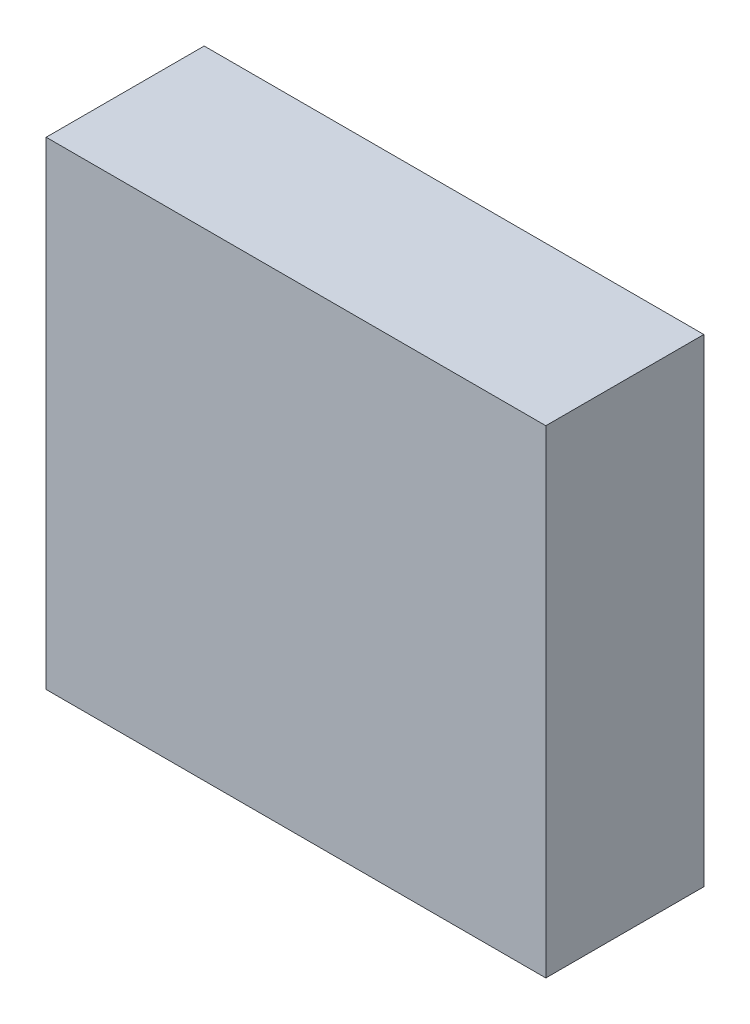
ISO-10303-21;
HEADER;
FILE_DESCRIPTION(('STEP AP214'),'2;1');
FILE_NAME('part.step','',(''),(''),'','','');
FILE_SCHEMA(('AUTOMOTIVE_DESIGN { 1 0 10303 214 1 1 1 1 }'));
ENDSEC;
DATA;
#1=APPLICATION_CONTEXT('core data for automotive mechanical design processes');
#2=APPLICATION_PROTOCOL_DEFINITION('international standard','automotive_design',2000,#1);
#3=PRODUCT_CONTEXT('',#1,'mechanical');
#4=PRODUCT('Part','Part','',(#3));
#5=PRODUCT_RELATED_PRODUCT_CATEGORY('part','',(#4));
#6=PRODUCT_DEFINITION_FORMATION('','',#4);
#7=PRODUCT_DEFINITION_CONTEXT('part definition',#1,'design');
#8=PRODUCT_DEFINITION('design','',#6,#7);
#9=PRODUCT_DEFINITION_SHAPE('','',#8);
#10=(LENGTH_UNIT() NAMED_UNIT(*) SI_UNIT(.MILLI.,.METRE.));
#11=(NAMED_UNIT(*) PLANE_ANGLE_UNIT() SI_UNIT($,.RADIAN.));
#12=(NAMED_UNIT(*) SI_UNIT($,.STERADIAN.) SOLID_ANGLE_UNIT());
#13=UNCERTAINTY_MEASURE_WITH_UNIT(LENGTH_MEASURE(1.E-05),#10,'distance_accuracy_value','');
#14=(GEOMETRIC_REPRESENTATION_CONTEXT(3) GLOBAL_UNCERTAINTY_ASSIGNED_CONTEXT((#13)) GLOBAL_UNIT_ASSIGNED_CONTEXT((#10,
#11,#12)) REPRESENTATION_CONTEXT('',''));
#15=CARTESIAN_POINT('',(0.,0.,0.));
#16=DIRECTION('',(0.,0.,1.));
#17=DIRECTION('',(1.,0.,0.));
#18=AXIS2_PLACEMENT_3D('',#15,#16,#17);
#19=CARTESIAN_POINT('',(-58.5,-56.,37.));
#20=DIRECTION('',(-1.,0.,0.));
#21=DIRECTION('',(0.,0.,1.));
#22=AXIS2_PLACEMENT_3D('',#19,#20,#21);
#23=PLANE('',#22);
#24=DIRECTION('',(0.,1.,0.));
#25=VECTOR('',#24,1.);
#26=CARTESIAN_POINT('',(-58.5,-56.,0.));
#27=LINE('',#26,#25);
#28=CARTESIAN_POINT('',(-58.5,-56.,0.));
#29=VERTEX_POINT('',#28);
#30=CARTESIAN_POINT('',(-58.5,56.,0.));
#31=VERTEX_POINT('',#30);
#32=EDGE_CURVE('E110',#29,#31,#27,.T.);
#33=ORIENTED_EDGE('',*,*,#32,.F.);
#34=DIRECTION('',(0.,0.,-1.));
#35=VECTOR('',#34,1.);
#36=CARTESIAN_POINT('',(-58.5,-56.,37.));
#37=LINE('',#36,#35);
#38=CARTESIAN_POINT('',(-58.5,-56.,37.));
#39=VERTEX_POINT('',#38);
#40=EDGE_CURVE('E11',#39,#29,#37,.T.);
#41=ORIENTED_EDGE('',*,*,#40,.F.);
#42=DIRECTION('',(0.,1.,0.));
#43=VECTOR('',#42,1.);
#44=CARTESIAN_POINT('',(-58.5,-56.,37.));
#45=LINE('',#44,#43);
#46=CARTESIAN_POINT('',(-58.5,56.,37.));
#47=VERTEX_POINT('',#46);
#48=EDGE_CURVE('E103',#39,#47,#45,.T.);
#49=ORIENTED_EDGE('',*,*,#48,.T.);
#50=DIRECTION('',(0.,0.,-1.));
#51=VECTOR('',#50,1.);
#52=CARTESIAN_POINT('',(-58.5,56.,37.));
#53=LINE('',#52,#51);
#54=EDGE_CURVE('E42',#47,#31,#53,.T.);
#55=ORIENTED_EDGE('',*,*,#54,.T.);
#56=EDGE_LOOP('',(#33,#41,#49,#55));
#57=FACE_BOUND('',#56,.T.);
#58=ADVANCED_FACE('F39',(#57),#23,.T.);
#59=CARTESIAN_POINT('',(-58.5,-56.,37.));
#60=DIRECTION('',(0.,1.,0.));
#61=DIRECTION('',(0.,0.,1.));
#62=AXIS2_PLACEMENT_3D('',#59,#60,#61);
#63=PLANE('',#62);
#64=DIRECTION('',(1.,0.,0.));
#65=VECTOR('',#64,1.);
#66=CARTESIAN_POINT('',(-58.5,-56.,0.));
#67=LINE('',#66,#65);
#68=CARTESIAN_POINT('',(58.5,-56.,0.));
#69=VERTEX_POINT('',#68);
#70=EDGE_CURVE('E73',#29,#69,#67,.T.);
#71=ORIENTED_EDGE('',*,*,#70,.T.);
#72=DIRECTION('',(0.,0.,-1.));
#73=VECTOR('',#72,1.);
#74=CARTESIAN_POINT('',(58.5,-56.,37.));
#75=LINE('',#74,#73);
#76=CARTESIAN_POINT('',(58.5,-56.,37.));
#77=VERTEX_POINT('',#76);
#78=EDGE_CURVE('E49',#77,#69,#75,.T.);
#79=ORIENTED_EDGE('',*,*,#78,.F.);
#80=DIRECTION('',(1.,0.,0.));
#81=VECTOR('',#80,1.);
#82=CARTESIAN_POINT('',(-58.5,-56.,37.));
#83=LINE('',#82,#81);
#84=EDGE_CURVE('E90',#39,#77,#83,.T.);
#85=ORIENTED_EDGE('',*,*,#84,.F.);
#86=ORIENTED_EDGE('',*,*,#40,.T.);
#87=EDGE_LOOP('',(#71,#79,#85,#86));
#88=FACE_BOUND('',#87,.T.);
#89=ADVANCED_FACE('F126',(#88),#63,.F.);
#90=CARTESIAN_POINT('',(58.5,-56.,37.));
#91=DIRECTION('',(-1.,0.,0.));
#92=DIRECTION('',(0.,0.,1.));
#93=AXIS2_PLACEMENT_3D('',#90,#91,#92);
#94=PLANE('',#93);
#95=DIRECTION('',(0.,1.,0.));
#96=VECTOR('',#95,1.);
#97=CARTESIAN_POINT('',(58.5,-56.,0.));
#98=LINE('',#97,#96);
#99=CARTESIAN_POINT('',(58.5,56.,0.));
#100=VERTEX_POINT('',#99);
#101=EDGE_CURVE('E98',#69,#100,#98,.T.);
#102=ORIENTED_EDGE('',*,*,#101,.T.);
#103=DIRECTION('',(0.,0.,-1.));
#104=VECTOR('',#103,1.);
#105=CARTESIAN_POINT('',(58.5,56.,37.));
#106=LINE('',#105,#104);
#107=CARTESIAN_POINT('',(58.5,56.,37.));
#108=VERTEX_POINT('',#107);
#109=EDGE_CURVE('E95',#108,#100,#106,.T.);
#110=ORIENTED_EDGE('',*,*,#109,.F.);
#111=DIRECTION('',(0.,1.,0.));
#112=VECTOR('',#111,1.);
#113=CARTESIAN_POINT('',(58.5,-56.,37.));
#114=LINE('',#113,#112);
#115=EDGE_CURVE('E85',#77,#108,#114,.T.);
#116=ORIENTED_EDGE('',*,*,#115,.F.);
#117=ORIENTED_EDGE('',*,*,#78,.T.);
#118=EDGE_LOOP('',(#102,#110,#116,#117));
#119=FACE_BOUND('',#118,.T.);
#120=ADVANCED_FACE('F96',(#119),#94,.F.);
#121=CARTESIAN_POINT('',(-58.5,56.,37.));
#122=DIRECTION('',(0.,1.,0.));
#123=DIRECTION('',(0.,0.,1.));
#124=AXIS2_PLACEMENT_3D('',#121,#122,#123);
#125=PLANE('',#124);
#126=DIRECTION('',(1.,0.,0.));
#127=VECTOR('',#126,1.);
#128=CARTESIAN_POINT('',(-58.5,56.,0.));
#129=LINE('',#128,#127);
#130=EDGE_CURVE('E114',#31,#100,#129,.T.);
#131=ORIENTED_EDGE('',*,*,#130,.F.);
#132=ORIENTED_EDGE('',*,*,#54,.F.);
#133=DIRECTION('',(1.,0.,0.));
#134=VECTOR('',#133,1.);
#135=CARTESIAN_POINT('',(-58.5,56.,37.));
#136=LINE('',#135,#134);
#137=EDGE_CURVE('E89',#47,#108,#136,.T.);
#138=ORIENTED_EDGE('',*,*,#137,.T.);
#139=ORIENTED_EDGE('',*,*,#109,.T.);
#140=EDGE_LOOP('',(#131,#132,#138,#139));
#141=FACE_BOUND('',#140,.T.);
#142=ADVANCED_FACE('F101',(#141),#125,.T.);
#143=CARTESIAN_POINT('',(0.,0.,37.));
#144=DIRECTION('',(0.,0.,-1.));
#145=DIRECTION('',(-1.,0.,0.));
#146=AXIS2_PLACEMENT_3D('',#143,#144,#145);
#147=PLANE('',#146);
#148=ORIENTED_EDGE('',*,*,#48,.F.);
#149=ORIENTED_EDGE('',*,*,#84,.T.);
#150=ORIENTED_EDGE('',*,*,#115,.T.);
#151=ORIENTED_EDGE('',*,*,#137,.F.);
#152=EDGE_LOOP('',(#148,#149,#150,#151));
#153=FACE_BOUND('',#152,.T.);
#154=ADVANCED_FACE('F88',(#153),#147,.F.);
#155=CARTESIAN_POINT('',(0.,0.,0.));
#156=DIRECTION('',(0.,0.,-1.));
#157=DIRECTION('',(-1.,0.,0.));
#158=AXIS2_PLACEMENT_3D('',#155,#156,#157);
#159=PLANE('',#158);
#160=ORIENTED_EDGE('',*,*,#32,.T.);
#161=ORIENTED_EDGE('',*,*,#130,.T.);
#162=ORIENTED_EDGE('',*,*,#101,.F.);
#163=ORIENTED_EDGE('',*,*,#70,.F.);
#164=EDGE_LOOP('',(#160,#161,#162,#163));
#165=FACE_BOUND('',#164,.T.);
#166=ADVANCED_FACE('F123',(#165),#159,.T.);
#167=CLOSED_SHELL('',(#58,#89,#120,#142,#154,#166));
#168=MANIFOLD_SOLID_BREP('B2',#167);
#169=ADVANCED_BREP_SHAPE_REPRESENTATION('',(#18,#168),#14);
#170=SHAPE_DEFINITION_REPRESENTATION(#9,#169);
ENDSEC;
END-ISO-10303-21;
